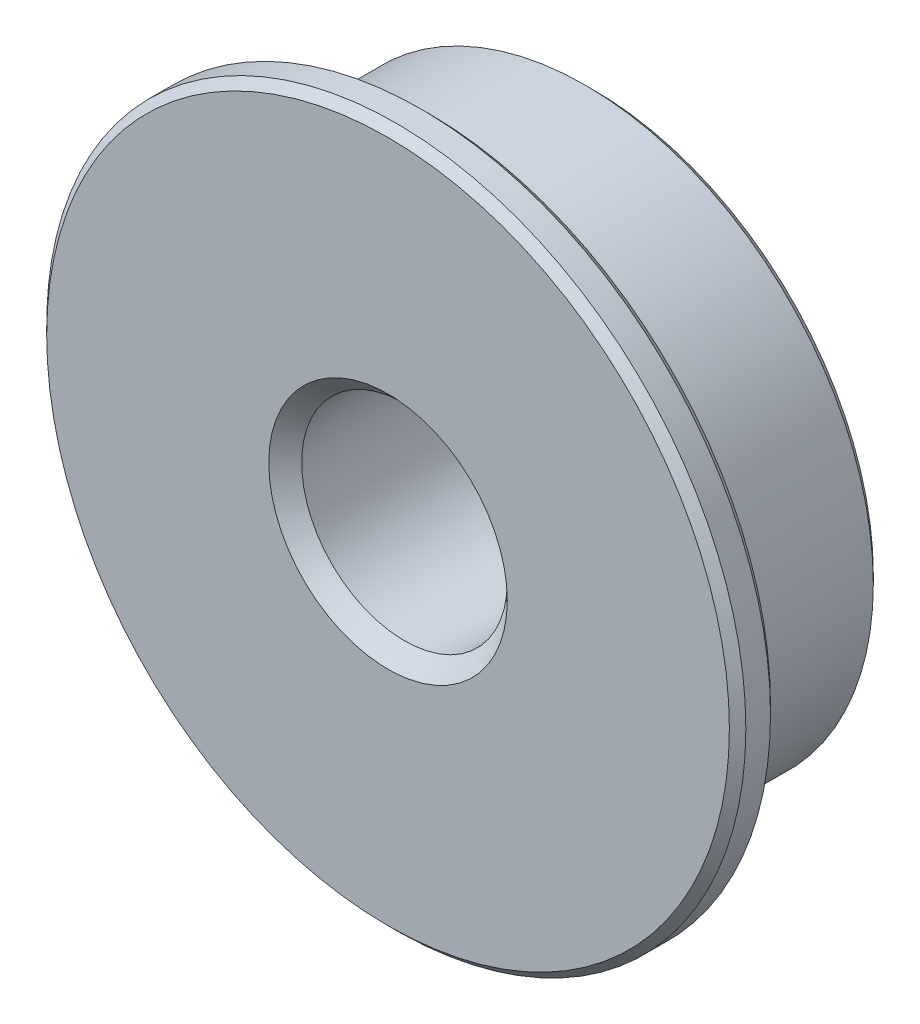
ISO-10303-21;
HEADER;
FILE_DESCRIPTION(('STEP AP214'),'2;1');
FILE_NAME('part.step','',(''),(''),'','','');
FILE_SCHEMA(('AUTOMOTIVE_DESIGN { 1 0 10303 214 1 1 1 1 }'));
ENDSEC;
DATA;
#1=APPLICATION_CONTEXT('core data for automotive mechanical design processes');
#2=APPLICATION_PROTOCOL_DEFINITION('international standard','automotive_design',2000,#1);
#3=PRODUCT_CONTEXT('',#1,'mechanical');
#4=PRODUCT('Part','Part','',(#3));
#5=PRODUCT_RELATED_PRODUCT_CATEGORY('part','',(#4));
#6=PRODUCT_DEFINITION_FORMATION('','',#4);
#7=PRODUCT_DEFINITION_CONTEXT('part definition',#1,'design');
#8=PRODUCT_DEFINITION('design','',#6,#7);
#9=PRODUCT_DEFINITION_SHAPE('','',#8);
#10=(LENGTH_UNIT() NAMED_UNIT(*) SI_UNIT(.MILLI.,.METRE.));
#11=(NAMED_UNIT(*) PLANE_ANGLE_UNIT() SI_UNIT($,.RADIAN.));
#12=(NAMED_UNIT(*) SI_UNIT($,.STERADIAN.) SOLID_ANGLE_UNIT());
#13=UNCERTAINTY_MEASURE_WITH_UNIT(LENGTH_MEASURE(1.E-05),#10,'distance_accuracy_value','');
#14=(GEOMETRIC_REPRESENTATION_CONTEXT(3) GLOBAL_UNCERTAINTY_ASSIGNED_CONTEXT((#13)) GLOBAL_UNIT_ASSIGNED_CONTEXT((#10,
#11,#12)) REPRESENTATION_CONTEXT('',''));
#15=CARTESIAN_POINT('',(0.,0.,0.));
#16=DIRECTION('',(0.,0.,1.));
#17=DIRECTION('',(1.,0.,0.));
#18=AXIS2_PLACEMENT_3D('',#15,#16,#17);
#19=CARTESIAN_POINT('',(0.,0.,2.5));
#20=DIRECTION('',(0.,0.,-1.));
#21=DIRECTION('',(-1.,0.,0.));
#22=AXIS2_PLACEMENT_3D('',#19,#20,#21);
#23=CYLINDRICAL_SURFACE('',#22,7.);
#24=CARTESIAN_POINT('',(0.,0.,-2.3));
#25=DIRECTION('',(0.,0.,1.));
#26=DIRECTION('',(1.,0.,0.));
#27=AXIS2_PLACEMENT_3D('',#24,#25,#26);
#28=CIRCLE('',#27,7.);
#29=CARTESIAN_POINT('',(7.,0.,-2.3));
#30=VERTEX_POINT('',#29);
#31=EDGE_CURVE('E57',#30,#30,#28,.T.);
#32=ORIENTED_EDGE('',*,*,#31,.T.);
#33=EDGE_LOOP('',(#32));
#34=FACE_BOUND('',#33,.T.);
#35=CARTESIAN_POINT('',(0.,0.,1.5));
#36=DIRECTION('',(0.,0.,1.));
#37=DIRECTION('',(1.,0.,0.));
#38=AXIS2_PLACEMENT_3D('',#35,#36,#37);
#39=CIRCLE('',#38,7.);
#40=CARTESIAN_POINT('',(7.,0.,1.5));
#41=VERTEX_POINT('',#40);
#42=EDGE_CURVE('E72',#41,#41,#39,.T.);
#43=ORIENTED_EDGE('',*,*,#42,.F.);
#44=EDGE_LOOP('',(#43));
#45=FACE_BOUND('',#44,.T.);
#46=ADVANCED_FACE('F33',(#34,#45),#23,.T.);
#47=CARTESIAN_POINT('',(0.,0.,2.5));
#48=DIRECTION('',(0.,0.,1.));
#49=DIRECTION('',(1.,0.,0.));
#50=AXIS2_PLACEMENT_3D('',#47,#48,#49);
#51=PLANE('',#50);
#52=CARTESIAN_POINT('',(0.,0.,2.5));
#53=DIRECTION('',(0.,0.,1.));
#54=DIRECTION('',(1.,0.,0.));
#55=AXIS2_PLACEMENT_3D('',#52,#53,#54);
#56=CIRCLE('',#55,2.9);
#57=CARTESIAN_POINT('',(2.9,0.,2.5));
#58=VERTEX_POINT('',#57);
#59=EDGE_CURVE('E41',#58,#58,#56,.F.);
#60=ORIENTED_EDGE('',*,*,#59,.T.);
#61=EDGE_LOOP('',(#60));
#62=FACE_BOUND('',#61,.T.);
#63=CARTESIAN_POINT('',(0.,0.,2.5));
#64=DIRECTION('',(0.,0.,1.));
#65=DIRECTION('',(1.,0.,0.));
#66=AXIS2_PLACEMENT_3D('',#63,#64,#65);
#67=CIRCLE('',#66,8.30000000000001);
#68=CARTESIAN_POINT('',(8.30000000000001,0.,2.5));
#69=VERTEX_POINT('',#68);
#70=EDGE_CURVE('E60',#69,#69,#67,.T.);
#71=ORIENTED_EDGE('',*,*,#70,.T.);
#72=EDGE_LOOP('',(#71));
#73=FACE_BOUND('',#72,.T.);
#74=ADVANCED_FACE('F79',(#62,#73),#51,.T.);
#75=CARTESIAN_POINT('',(0.,0.,-2.5));
#76=DIRECTION('',(0.,0.,1.));
#77=DIRECTION('',(1.,0.,0.));
#78=AXIS2_PLACEMENT_3D('',#75,#76,#77);
#79=PLANE('',#78);
#80=CARTESIAN_POINT('',(0.,0.,-2.5));
#81=DIRECTION('',(0.,0.,1.));
#82=DIRECTION('',(1.,0.,0.));
#83=AXIS2_PLACEMENT_3D('',#80,#81,#82);
#84=CIRCLE('',#83,2.9);
#85=CARTESIAN_POINT('',(2.9,0.,-2.5));
#86=VERTEX_POINT('',#85);
#87=EDGE_CURVE('E10',#86,#86,#84,.T.);
#88=ORIENTED_EDGE('',*,*,#87,.T.);
#89=EDGE_LOOP('',(#88));
#90=FACE_BOUND('',#89,.T.);
#91=CARTESIAN_POINT('',(0.,0.,-2.5));
#92=DIRECTION('',(0.,0.,1.));
#93=DIRECTION('',(1.,0.,0.));
#94=AXIS2_PLACEMENT_3D('',#91,#92,#93);
#95=CIRCLE('',#94,6.8);
#96=CARTESIAN_POINT('',(6.8,0.,-2.5));
#97=VERTEX_POINT('',#96);
#98=EDGE_CURVE('E54',#97,#97,#95,.F.);
#99=ORIENTED_EDGE('',*,*,#98,.T.);
#100=EDGE_LOOP('',(#99));
#101=FACE_BOUND('',#100,.T.);
#102=ADVANCED_FACE('F86',(#90,#101),#79,.F.);
#103=CARTESIAN_POINT('',(0.,0.,2.5));
#104=DIRECTION('',(0.,0.,-1.));
#105=DIRECTION('',(-1.,0.,0.));
#106=AXIS2_PLACEMENT_3D('',#103,#104,#105);
#107=CYLINDRICAL_SURFACE('',#106,2.5);
#108=CARTESIAN_POINT('',(0.,0.,2.1));
#109=DIRECTION('',(0.,0.,1.));
#110=DIRECTION('',(1.,0.,0.));
#111=AXIS2_PLACEMENT_3D('',#108,#109,#110);
#112=CIRCLE('',#111,2.5);
#113=CARTESIAN_POINT('',(2.5,0.,2.1));
#114=VERTEX_POINT('',#113);
#115=EDGE_CURVE('E45',#114,#114,#112,.T.);
#116=ORIENTED_EDGE('',*,*,#115,.T.);
#117=EDGE_LOOP('',(#116));
#118=FACE_BOUND('',#117,.T.);
#119=CARTESIAN_POINT('',(0.,0.,-2.09999999999999));
#120=DIRECTION('',(0.,0.,1.));
#121=DIRECTION('',(1.,0.,0.));
#122=AXIS2_PLACEMENT_3D('',#119,#120,#121);
#123=CIRCLE('',#122,2.5);
#124=CARTESIAN_POINT('',(2.5,0.,-2.09999999999999));
#125=VERTEX_POINT('',#124);
#126=EDGE_CURVE('E49',#125,#125,#123,.F.);
#127=ORIENTED_EDGE('',*,*,#126,.T.);
#128=EDGE_LOOP('',(#127));
#129=FACE_BOUND('',#128,.T.);
#130=ADVANCED_FACE('F124',(#118,#129),#107,.F.);
#131=CARTESIAN_POINT('',(0.,0.,1.5));
#132=DIRECTION('',(0.,0.,1.));
#133=DIRECTION('',(1.,0.,0.));
#134=AXIS2_PLACEMENT_3D('',#131,#132,#133);
#135=PLANE('',#134);
#136=CARTESIAN_POINT('',(0.,0.,1.5));
#137=DIRECTION('',(0.,0.,1.));
#138=DIRECTION('',(1.,0.,0.));
#139=AXIS2_PLACEMENT_3D('',#136,#137,#138);
#140=CIRCLE('',#139,8.3);
#141=CARTESIAN_POINT('',(8.3,0.,1.5));
#142=VERTEX_POINT('',#141);
#143=EDGE_CURVE('E63',#142,#142,#140,.F.);
#144=ORIENTED_EDGE('',*,*,#143,.T.);
#145=EDGE_LOOP('',(#144));
#146=FACE_BOUND('',#145,.T.);
#147=ORIENTED_EDGE('',*,*,#42,.T.);
#148=EDGE_LOOP('',(#147));
#149=FACE_BOUND('',#148,.T.);
#150=ADVANCED_FACE('F76',(#146,#149),#135,.F.);
#151=CARTESIAN_POINT('',(0.,0.,1.5));
#152=DIRECTION('',(0.,0.,1.));
#153=DIRECTION('',(1.,0.,0.));
#154=AXIS2_PLACEMENT_3D('',#151,#152,#153);
#155=CYLINDRICAL_SURFACE('',#154,8.5);
#156=CARTESIAN_POINT('',(0.,0.,1.7));
#157=DIRECTION('',(0.,0.,1.));
#158=DIRECTION('',(1.,0.,0.));
#159=AXIS2_PLACEMENT_3D('',#156,#157,#158);
#160=CIRCLE('',#159,8.5);
#161=CARTESIAN_POINT('',(8.5,0.,1.7));
#162=VERTEX_POINT('',#161);
#163=EDGE_CURVE('E66',#162,#162,#160,.T.);
#164=ORIENTED_EDGE('',*,*,#163,.T.);
#165=EDGE_LOOP('',(#164));
#166=FACE_BOUND('',#165,.T.);
#167=CARTESIAN_POINT('',(0.,0.,2.3));
#168=DIRECTION('',(0.,0.,1.));
#169=DIRECTION('',(1.,0.,0.));
#170=AXIS2_PLACEMENT_3D('',#167,#168,#169);
#171=CIRCLE('',#170,8.5);
#172=CARTESIAN_POINT('',(8.5,0.,2.3));
#173=VERTEX_POINT('',#172);
#174=EDGE_CURVE('E69',#173,#173,#171,.F.);
#175=ORIENTED_EDGE('',*,*,#174,.T.);
#176=EDGE_LOOP('',(#175));
#177=FACE_BOUND('',#176,.T.);
#178=ADVANCED_FACE('F98',(#166,#177),#155,.T.);
#179=CARTESIAN_POINT('',(0.,0.,1.7));
#180=DIRECTION('',(0.,0.,1.));
#181=DIRECTION('',(1.,0.,0.));
#182=AXIS2_PLACEMENT_3D('',#179,#180,#181);
#183=CONICAL_SURFACE('',#182,8.5,0.785398163397453);
#184=ORIENTED_EDGE('',*,*,#143,.F.);
#185=EDGE_LOOP('',(#184));
#186=FACE_BOUND('',#185,.T.);
#187=ORIENTED_EDGE('',*,*,#163,.F.);
#188=EDGE_LOOP('',(#187));
#189=FACE_BOUND('',#188,.T.);
#190=ADVANCED_FACE('F91',(#186,#189),#183,.T.);
#191=CARTESIAN_POINT('',(0.,0.,2.5));
#192=DIRECTION('',(0.,0.,-1.));
#193=DIRECTION('',(-1.,0.,0.));
#194=AXIS2_PLACEMENT_3D('',#191,#192,#193);
#195=CONICAL_SURFACE('',#194,8.30000000000001,0.785398163397444);
#196=ORIENTED_EDGE('',*,*,#174,.F.);
#197=EDGE_LOOP('',(#196));
#198=FACE_BOUND('',#197,.T.);
#199=ORIENTED_EDGE('',*,*,#70,.F.);
#200=EDGE_LOOP('',(#199));
#201=FACE_BOUND('',#200,.T.);
#202=ADVANCED_FACE('F97',(#198,#201),#195,.T.);
#203=CARTESIAN_POINT('',(0.,0.,-2.3));
#204=DIRECTION('',(0.,0.,1.));
#205=DIRECTION('',(1.,0.,0.));
#206=AXIS2_PLACEMENT_3D('',#203,#204,#205);
#207=CONICAL_SURFACE('',#206,7.,0.785398163397446);
#208=ORIENTED_EDGE('',*,*,#98,.F.);
#209=EDGE_LOOP('',(#208));
#210=FACE_BOUND('',#209,.T.);
#211=ORIENTED_EDGE('',*,*,#31,.F.);
#212=EDGE_LOOP('',(#211));
#213=FACE_BOUND('',#212,.T.);
#214=ADVANCED_FACE('F105',(#210,#213),#207,.T.);
#215=CARTESIAN_POINT('',(0.,0.,2.1));
#216=DIRECTION('',(0.,0.,1.));
#217=DIRECTION('',(1.,0.,0.));
#218=AXIS2_PLACEMENT_3D('',#215,#216,#217);
#219=CONICAL_SURFACE('',#218,2.5,0.785398163397452);
#220=ORIENTED_EDGE('',*,*,#59,.F.);
#221=EDGE_LOOP('',(#220));
#222=FACE_BOUND('',#221,.T.);
#223=ORIENTED_EDGE('',*,*,#115,.F.);
#224=EDGE_LOOP('',(#223));
#225=FACE_BOUND('',#224,.T.);
#226=ADVANCED_FACE('F111',(#222,#225),#219,.F.);
#227=CARTESIAN_POINT('',(0.,0.,-2.5));
#228=DIRECTION('',(0.,0.,-1.));
#229=DIRECTION('',(-1.,0.,0.));
#230=AXIS2_PLACEMENT_3D('',#227,#228,#229);
#231=CONICAL_SURFACE('',#230,2.9,0.785398163397448);
#232=ORIENTED_EDGE('',*,*,#126,.F.);
#233=EDGE_LOOP('',(#232));
#234=FACE_BOUND('',#233,.T.);
#235=ORIENTED_EDGE('',*,*,#87,.F.);
#236=EDGE_LOOP('',(#235));
#237=FACE_BOUND('',#236,.T.);
#238=ADVANCED_FACE('F36',(#234,#237),#231,.F.);
#239=CLOSED_SHELL('',(#46,#74,#102,#130,#150,#178,#190,#202,#214,#226,#238));
#240=MANIFOLD_SOLID_BREP('B2',#239);
#241=ADVANCED_BREP_SHAPE_REPRESENTATION('',(#18,#240),#14);
#242=SHAPE_DEFINITION_REPRESENTATION(#9,#241);
ENDSEC;
END-ISO-10303-21;
